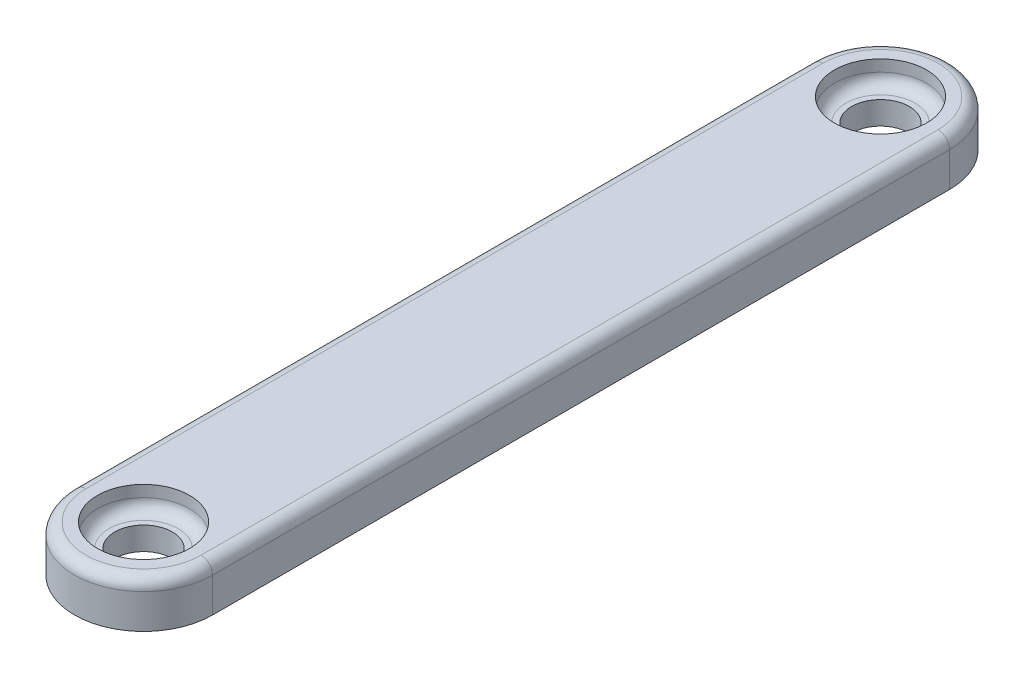
ISO-10303-21;
HEADER;
FILE_DESCRIPTION(('STEP AP214'),'2;1');
FILE_NAME('part.step','',(''),(''),'','','');
FILE_SCHEMA(('AUTOMOTIVE_DESIGN { 1 0 10303 214 1 1 1 1 }'));
ENDSEC;
DATA;
#1=APPLICATION_CONTEXT('core data for automotive mechanical design processes');
#2=APPLICATION_PROTOCOL_DEFINITION('international standard','automotive_design',2000,#1);
#3=PRODUCT_CONTEXT('',#1,'mechanical');
#4=PRODUCT('Part','Part','',(#3));
#5=PRODUCT_RELATED_PRODUCT_CATEGORY('part','',(#4));
#6=PRODUCT_DEFINITION_FORMATION('','',#4);
#7=PRODUCT_DEFINITION_CONTEXT('part definition',#1,'design');
#8=PRODUCT_DEFINITION('design','',#6,#7);
#9=PRODUCT_DEFINITION_SHAPE('','',#8);
#10=(LENGTH_UNIT() NAMED_UNIT(*) SI_UNIT(.MILLI.,.METRE.));
#11=(NAMED_UNIT(*) PLANE_ANGLE_UNIT() SI_UNIT($,.RADIAN.));
#12=(NAMED_UNIT(*) SI_UNIT($,.STERADIAN.) SOLID_ANGLE_UNIT());
#13=UNCERTAINTY_MEASURE_WITH_UNIT(LENGTH_MEASURE(1.E-05),#10,'distance_accuracy_value','');
#14=(GEOMETRIC_REPRESENTATION_CONTEXT(3) GLOBAL_UNCERTAINTY_ASSIGNED_CONTEXT((#13)) GLOBAL_UNIT_ASSIGNED_CONTEXT((#10,
#11,#12)) REPRESENTATION_CONTEXT('',''));
#15=CARTESIAN_POINT('',(0.,0.,0.));
#16=DIRECTION('',(0.,0.,1.));
#17=DIRECTION('',(1.,0.,0.));
#18=AXIS2_PLACEMENT_3D('',#15,#16,#17);
#19=CARTESIAN_POINT('',(0.,2.,16.));
#20=DIRECTION('',(0.,-1.,0.));
#21=DIRECTION('',(0.,0.,-1.));
#22=AXIS2_PLACEMENT_3D('',#19,#20,#21);
#23=CYLINDRICAL_SURFACE('',#22,1.25);
#24=CARTESIAN_POINT('',(0.,0.,16.));
#25=DIRECTION('',(0.,1.,0.));
#26=DIRECTION('',(0.,0.,1.));
#27=AXIS2_PLACEMENT_3D('',#24,#25,#26);
#28=CIRCLE('',#27,1.25);
#29=CARTESIAN_POINT('',(0.,0.,17.25));
#30=VERTEX_POINT('',#29);
#31=EDGE_CURVE('E114',#30,#30,#28,.T.);
#32=ORIENTED_EDGE('',*,*,#31,.F.);
#33=EDGE_LOOP('',(#32));
#34=FACE_BOUND('',#33,.T.);
#35=CARTESIAN_POINT('',(0.,1.,16.));
#36=DIRECTION('',(0.,1.,0.));
#37=DIRECTION('',(0.,0.,1.));
#38=AXIS2_PLACEMENT_3D('',#35,#36,#37);
#39=CIRCLE('',#38,1.25);
#40=CARTESIAN_POINT('',(0.,1.,17.25));
#41=VERTEX_POINT('',#40);
#42=EDGE_CURVE('E131',#41,#41,#39,.T.);
#43=ORIENTED_EDGE('',*,*,#42,.T.);
#44=EDGE_LOOP('',(#43));
#45=FACE_BOUND('',#44,.T.);
#46=ADVANCED_FACE('F34',(#34,#45),#23,.F.);
#47=CARTESIAN_POINT('',(0.,2.,16.));
#48=DIRECTION('',(0.,-1.,0.));
#49=DIRECTION('',(0.,0.,-1.));
#50=AXIS2_PLACEMENT_3D('',#47,#48,#49);
#51=PLANE('',#50);
#52=DIRECTION('',(0.,0.,1.));
#53=VECTOR('',#52,1.);
#54=CARTESIAN_POINT('',(-2.5,2.,16.));
#55=LINE('',#54,#53);
#56=CARTESIAN_POINT('',(-2.5,2.,-16.));
#57=VERTEX_POINT('',#56);
#58=CARTESIAN_POINT('',(-2.5,2.,16.));
#59=VERTEX_POINT('',#58);
#60=EDGE_CURVE('E138',#57,#59,#55,.T.);
#61=ORIENTED_EDGE('',*,*,#60,.T.);
#62=CARTESIAN_POINT('',(0.,2.,16.));
#63=DIRECTION('',(0.,-1.,0.));
#64=DIRECTION('',(0.,0.,-1.));
#65=AXIS2_PLACEMENT_3D('',#62,#63,#64);
#66=CIRCLE('',#65,2.5);
#67=CARTESIAN_POINT('',(2.5,2.,16.));
#68=VERTEX_POINT('',#67);
#69=EDGE_CURVE('E140',#59,#68,#66,.F.);
#70=ORIENTED_EDGE('',*,*,#69,.T.);
#71=DIRECTION('',(0.,0.,-1.));
#72=VECTOR('',#71,1.);
#73=CARTESIAN_POINT('',(2.5,2.,16.));
#74=LINE('',#73,#72);
#75=CARTESIAN_POINT('',(2.5,2.,-16.));
#76=VERTEX_POINT('',#75);
#77=EDGE_CURVE('E99',#68,#76,#74,.T.);
#78=ORIENTED_EDGE('',*,*,#77,.T.);
#79=CARTESIAN_POINT('',(0.,2.,-16.));
#80=DIRECTION('',(0.,-1.,0.));
#81=DIRECTION('',(0.,0.,-1.));
#82=AXIS2_PLACEMENT_3D('',#79,#80,#81);
#83=CIRCLE('',#82,2.5);
#84=EDGE_CURVE('E136',#76,#57,#83,.F.);
#85=ORIENTED_EDGE('',*,*,#84,.T.);
#86=EDGE_LOOP('',(#61,#70,#78,#85));
#87=FACE_BOUND('',#86,.T.);
#88=CARTESIAN_POINT('',(0.,2.,16.));
#89=DIRECTION('',(0.,1.,0.));
#90=DIRECTION('',(0.,0.,1.));
#91=AXIS2_PLACEMENT_3D('',#88,#89,#90);
#92=CIRCLE('',#91,2.);
#93=CARTESIAN_POINT('',(0.,2.,18.));
#94=VERTEX_POINT('',#93);
#95=EDGE_CURVE('E132',#94,#94,#92,.T.);
#96=ORIENTED_EDGE('',*,*,#95,.F.);
#97=EDGE_LOOP('',(#96));
#98=FACE_BOUND('',#97,.T.);
#99=CARTESIAN_POINT('',(0.,2.,-16.));
#100=DIRECTION('',(0.,1.,0.));
#101=DIRECTION('',(0.,0.,-1.));
#102=AXIS2_PLACEMENT_3D('',#99,#100,#101);
#103=CIRCLE('',#102,2.);
#104=CARTESIAN_POINT('',(0.,2.,-18.));
#105=VERTEX_POINT('',#104);
#106=EDGE_CURVE('E167',#105,#105,#103,.T.);
#107=ORIENTED_EDGE('',*,*,#106,.F.);
#108=EDGE_LOOP('',(#107));
#109=FACE_BOUND('',#108,.T.);
#110=ADVANCED_FACE('F198',(#87,#98,#109),#51,.F.);
#111=CARTESIAN_POINT('',(0.,0.,16.));
#112=DIRECTION('',(0.,-1.,0.));
#113=DIRECTION('',(0.,0.,-1.));
#114=AXIS2_PLACEMENT_3D('',#111,#112,#113);
#115=PLANE('',#114);
#116=ORIENTED_EDGE('',*,*,#31,.T.);
#117=EDGE_LOOP('',(#116));
#118=FACE_BOUND('',#117,.T.);
#119=CARTESIAN_POINT('',(0.,0.,16.));
#120=DIRECTION('',(0.,1.,0.));
#121=DIRECTION('',(0.,0.,-1.));
#122=AXIS2_PLACEMENT_3D('',#119,#120,#121);
#123=CIRCLE('',#122,3.);
#124=CARTESIAN_POINT('',(-3.,0.,16.));
#125=VERTEX_POINT('',#124);
#126=CARTESIAN_POINT('',(3.,0.,16.));
#127=VERTEX_POINT('',#126);
#128=EDGE_CURVE('E107',#125,#127,#123,.T.);
#129=ORIENTED_EDGE('',*,*,#128,.F.);
#130=DIRECTION('',(0.,0.,1.));
#131=VECTOR('',#130,1.);
#132=CARTESIAN_POINT('',(-3.,0.,16.));
#133=LINE('',#132,#131);
#134=CARTESIAN_POINT('',(-3.,0.,-16.));
#135=VERTEX_POINT('',#134);
#136=EDGE_CURVE('E122',#135,#125,#133,.T.);
#137=ORIENTED_EDGE('',*,*,#136,.F.);
#138=CARTESIAN_POINT('',(0.,0.,-16.));
#139=DIRECTION('',(0.,1.,0.));
#140=DIRECTION('',(0.,0.,-1.));
#141=AXIS2_PLACEMENT_3D('',#138,#139,#140);
#142=CIRCLE('',#141,3.);
#143=CARTESIAN_POINT('',(3.,0.,-16.));
#144=VERTEX_POINT('',#143);
#145=EDGE_CURVE('E109',#144,#135,#142,.T.);
#146=ORIENTED_EDGE('',*,*,#145,.F.);
#147=DIRECTION('',(0.,0.,-1.));
#148=VECTOR('',#147,1.);
#149=CARTESIAN_POINT('',(3.,0.,-16.));
#150=LINE('',#149,#148);
#151=EDGE_CURVE('E92',#127,#144,#150,.T.);
#152=ORIENTED_EDGE('',*,*,#151,.F.);
#153=EDGE_LOOP('',(#129,#137,#146,#152));
#154=FACE_BOUND('',#153,.T.);
#155=CARTESIAN_POINT('',(0.,0.,-16.));
#156=DIRECTION('',(0.,1.,0.));
#157=DIRECTION('',(0.,0.,1.));
#158=AXIS2_PLACEMENT_3D('',#155,#156,#157);
#159=CIRCLE('',#158,1.25);
#160=CARTESIAN_POINT('',(0.,0.,-14.75));
#161=VERTEX_POINT('',#160);
#162=EDGE_CURVE('E117',#161,#161,#159,.T.);
#163=ORIENTED_EDGE('',*,*,#162,.T.);
#164=EDGE_LOOP('',(#163));
#165=FACE_BOUND('',#164,.T.);
#166=ADVANCED_FACE('F104',(#118,#154,#165),#115,.T.);
#167=CARTESIAN_POINT('',(0.,2.,16.));
#168=DIRECTION('',(0.,-1.,0.));
#169=DIRECTION('',(0.,0.,-1.));
#170=AXIS2_PLACEMENT_3D('',#167,#168,#169);
#171=CYLINDRICAL_SURFACE('',#170,3.);
#172=DIRECTION('',(0.,-1.,0.));
#173=VECTOR('',#172,1.);
#174=CARTESIAN_POINT('',(3.,2.,16.));
#175=LINE('',#174,#173);
#176=CARTESIAN_POINT('',(3.,1.5,16.));
#177=VERTEX_POINT('',#176);
#178=EDGE_CURVE('E89',#177,#127,#175,.T.);
#179=ORIENTED_EDGE('',*,*,#178,.F.);
#180=CARTESIAN_POINT('',(0.,1.5,16.));
#181=DIRECTION('',(0.,-1.,0.));
#182=DIRECTION('',(0.,0.,-1.));
#183=AXIS2_PLACEMENT_3D('',#180,#181,#182);
#184=CIRCLE('',#183,3.);
#185=CARTESIAN_POINT('',(-3.,1.5,16.));
#186=VERTEX_POINT('',#185);
#187=EDGE_CURVE('E143',#177,#186,#184,.T.);
#188=ORIENTED_EDGE('',*,*,#187,.T.);
#189=DIRECTION('',(0.,-1.,0.));
#190=VECTOR('',#189,1.);
#191=CARTESIAN_POINT('',(-3.,2.,16.));
#192=LINE('',#191,#190);
#193=EDGE_CURVE('E112',#186,#125,#192,.T.);
#194=ORIENTED_EDGE('',*,*,#193,.T.);
#195=ORIENTED_EDGE('',*,*,#128,.T.);
#196=EDGE_LOOP('',(#179,#188,#194,#195));
#197=FACE_BOUND('',#196,.T.);
#198=ADVANCED_FACE('F111',(#197),#171,.T.);
#199=CARTESIAN_POINT('',(3.,2.,-16.));
#200=DIRECTION('',(-1.,0.,0.));
#201=DIRECTION('',(0.,0.,1.));
#202=AXIS2_PLACEMENT_3D('',#199,#200,#201);
#203=PLANE('',#202);
#204=DIRECTION('',(0.,-1.,0.));
#205=VECTOR('',#204,1.);
#206=CARTESIAN_POINT('',(3.,2.,-16.));
#207=LINE('',#206,#205);
#208=CARTESIAN_POINT('',(3.,1.5,-16.));
#209=VERTEX_POINT('',#208);
#210=EDGE_CURVE('E100',#209,#144,#207,.T.);
#211=ORIENTED_EDGE('',*,*,#210,.F.);
#212=DIRECTION('',(0.,0.,-1.));
#213=VECTOR('',#212,1.);
#214=CARTESIAN_POINT('',(3.,1.5,-16.));
#215=LINE('',#214,#213);
#216=EDGE_CURVE('E11',#209,#177,#215,.F.);
#217=ORIENTED_EDGE('',*,*,#216,.T.);
#218=ORIENTED_EDGE('',*,*,#178,.T.);
#219=ORIENTED_EDGE('',*,*,#151,.T.);
#220=EDGE_LOOP('',(#211,#217,#218,#219));
#221=FACE_BOUND('',#220,.T.);
#222=ADVANCED_FACE('F91',(#221),#203,.F.);
#223=CARTESIAN_POINT('',(0.,2.,-16.));
#224=DIRECTION('',(0.,-1.,0.));
#225=DIRECTION('',(0.,0.,-1.));
#226=AXIS2_PLACEMENT_3D('',#223,#224,#225);
#227=CYLINDRICAL_SURFACE('',#226,3.);
#228=DIRECTION('',(0.,-1.,0.));
#229=VECTOR('',#228,1.);
#230=CARTESIAN_POINT('',(-3.,2.,-16.));
#231=LINE('',#230,#229);
#232=CARTESIAN_POINT('',(-3.,1.5,-16.));
#233=VERTEX_POINT('',#232);
#234=EDGE_CURVE('E125',#233,#135,#231,.T.);
#235=ORIENTED_EDGE('',*,*,#234,.F.);
#236=CARTESIAN_POINT('',(0.,1.5,-16.));
#237=DIRECTION('',(0.,-1.,0.));
#238=DIRECTION('',(0.,0.,-1.));
#239=AXIS2_PLACEMENT_3D('',#236,#237,#238);
#240=CIRCLE('',#239,3.);
#241=EDGE_CURVE('E51',#233,#209,#240,.T.);
#242=ORIENTED_EDGE('',*,*,#241,.T.);
#243=ORIENTED_EDGE('',*,*,#210,.T.);
#244=ORIENTED_EDGE('',*,*,#145,.T.);
#245=EDGE_LOOP('',(#235,#242,#243,#244));
#246=FACE_BOUND('',#245,.T.);
#247=ADVANCED_FACE('F193',(#246),#227,.T.);
#248=CARTESIAN_POINT('',(-3.,2.,16.));
#249=DIRECTION('',(1.,0.,0.));
#250=DIRECTION('',(0.,0.,-1.));
#251=AXIS2_PLACEMENT_3D('',#248,#249,#250);
#252=PLANE('',#251);
#253=ORIENTED_EDGE('',*,*,#193,.F.);
#254=DIRECTION('',(0.,0.,1.));
#255=VECTOR('',#254,1.);
#256=CARTESIAN_POINT('',(-3.,1.5,16.));
#257=LINE('',#256,#255);
#258=EDGE_CURVE('E59',#186,#233,#257,.F.);
#259=ORIENTED_EDGE('',*,*,#258,.T.);
#260=ORIENTED_EDGE('',*,*,#234,.T.);
#261=ORIENTED_EDGE('',*,*,#136,.T.);
#262=EDGE_LOOP('',(#253,#259,#260,#261));
#263=FACE_BOUND('',#262,.T.);
#264=ADVANCED_FACE('F183',(#263),#252,.F.);
#265=CARTESIAN_POINT('',(0.,2.,-16.));
#266=DIRECTION('',(0.,-1.,0.));
#267=DIRECTION('',(0.,0.,-1.));
#268=AXIS2_PLACEMENT_3D('',#265,#266,#267);
#269=CYLINDRICAL_SURFACE('',#268,1.25);
#270=CARTESIAN_POINT('',(0.,1.,-16.));
#271=DIRECTION('',(0.,-1.,0.));
#272=DIRECTION('',(0.,0.,-1.));
#273=AXIS2_PLACEMENT_3D('',#270,#271,#272);
#274=CIRCLE('',#273,1.25);
#275=CARTESIAN_POINT('',(0.,1.,-17.25));
#276=VERTEX_POINT('',#275);
#277=EDGE_CURVE('E128',#276,#276,#274,.T.);
#278=ORIENTED_EDGE('',*,*,#277,.F.);
#279=EDGE_LOOP('',(#278));
#280=FACE_BOUND('',#279,.T.);
#281=ORIENTED_EDGE('',*,*,#162,.F.);
#282=EDGE_LOOP('',(#281));
#283=FACE_BOUND('',#282,.T.);
#284=ADVANCED_FACE('F180',(#280,#283),#269,.F.);
#285=CARTESIAN_POINT('',(0.,1.,-16.));
#286=DIRECTION('',(0.,1.,0.));
#287=DIRECTION('',(0.,0.,1.));
#288=AXIS2_PLACEMENT_3D('',#285,#286,#287);
#289=CYLINDRICAL_SURFACE('',#288,2.);
#290=CARTESIAN_POINT('',(0.,1.5,-16.));
#291=DIRECTION('',(0.,-1.,0.));
#292=DIRECTION('',(0.,0.,-1.));
#293=AXIS2_PLACEMENT_3D('',#290,#291,#292);
#294=CIRCLE('',#293,2.);
#295=CARTESIAN_POINT('',(0.,1.5,-18.));
#296=VERTEX_POINT('',#295);
#297=EDGE_CURVE('E150',#296,#296,#294,.T.);
#298=ORIENTED_EDGE('',*,*,#297,.T.);
#299=EDGE_LOOP('',(#298));
#300=FACE_BOUND('',#299,.T.);
#301=ORIENTED_EDGE('',*,*,#106,.T.);
#302=EDGE_LOOP('',(#301));
#303=FACE_BOUND('',#302,.T.);
#304=ADVANCED_FACE('F182',(#300,#303),#289,.F.);
#305=CARTESIAN_POINT('',(0.,1.,-16.));
#306=DIRECTION('',(0.,-1.,0.));
#307=DIRECTION('',(0.,0.,-1.));
#308=AXIS2_PLACEMENT_3D('',#305,#306,#307);
#309=PLANE('',#308);
#310=CARTESIAN_POINT('',(0.,1.,-16.));
#311=DIRECTION('',(0.,-1.,0.));
#312=DIRECTION('',(0.,0.,-1.));
#313=AXIS2_PLACEMENT_3D('',#310,#311,#312);
#314=CIRCLE('',#313,1.5);
#315=CARTESIAN_POINT('',(0.,1.,-17.5));
#316=VERTEX_POINT('',#315);
#317=EDGE_CURVE('E147',#316,#316,#314,.F.);
#318=ORIENTED_EDGE('',*,*,#317,.T.);
#319=EDGE_LOOP('',(#318));
#320=FACE_BOUND('',#319,.T.);
#321=ORIENTED_EDGE('',*,*,#277,.T.);
#322=EDGE_LOOP('',(#321));
#323=FACE_BOUND('',#322,.T.);
#324=ADVANCED_FACE('F190',(#320,#323),#309,.F.);
#325=CARTESIAN_POINT('',(0.,1.,16.));
#326=DIRECTION('',(0.,1.,0.));
#327=DIRECTION('',(0.,0.,1.));
#328=AXIS2_PLACEMENT_3D('',#325,#326,#327);
#329=CYLINDRICAL_SURFACE('',#328,2.);
#330=CARTESIAN_POINT('',(0.,1.5,16.));
#331=DIRECTION('',(0.,1.,0.));
#332=DIRECTION('',(0.,0.,1.));
#333=AXIS2_PLACEMENT_3D('',#330,#331,#332);
#334=CIRCLE('',#333,2.);
#335=CARTESIAN_POINT('',(0.,1.5,18.));
#336=VERTEX_POINT('',#335);
#337=EDGE_CURVE('E43',#336,#336,#334,.F.);
#338=ORIENTED_EDGE('',*,*,#337,.T.);
#339=EDGE_LOOP('',(#338));
#340=FACE_BOUND('',#339,.T.);
#341=ORIENTED_EDGE('',*,*,#95,.T.);
#342=EDGE_LOOP('',(#341));
#343=FACE_BOUND('',#342,.T.);
#344=ADVANCED_FACE('F244',(#340,#343),#329,.F.);
#345=CARTESIAN_POINT('',(0.,1.,16.));
#346=DIRECTION('',(0.,1.,0.));
#347=DIRECTION('',(0.,0.,1.));
#348=AXIS2_PLACEMENT_3D('',#345,#346,#347);
#349=PLANE('',#348);
#350=CARTESIAN_POINT('',(0.,1.,16.));
#351=DIRECTION('',(0.,1.,0.));
#352=DIRECTION('',(0.,0.,1.));
#353=AXIS2_PLACEMENT_3D('',#350,#351,#352);
#354=CIRCLE('',#353,1.5);
#355=CARTESIAN_POINT('',(0.,1.,17.5));
#356=VERTEX_POINT('',#355);
#357=EDGE_CURVE('E153',#356,#356,#354,.T.);
#358=ORIENTED_EDGE('',*,*,#357,.T.);
#359=EDGE_LOOP('',(#358));
#360=FACE_BOUND('',#359,.T.);
#361=ORIENTED_EDGE('',*,*,#42,.F.);
#362=EDGE_LOOP('',(#361));
#363=FACE_BOUND('',#362,.T.);
#364=ADVANCED_FACE('F230',(#360,#363),#349,.T.);
#365=CARTESIAN_POINT('',(0.,1.5,-16.));
#366=DIRECTION('',(0.,-1.,0.));
#367=DIRECTION('',(0.,0.,-1.));
#368=AXIS2_PLACEMENT_3D('',#365,#366,#367);
#369=TOROIDAL_SURFACE('',#368,2.5,0.5);
#370=CARTESIAN_POINT('',(2.5,1.5,-16.));
#371=DIRECTION('',(0.,0.,1.));
#372=DIRECTION('',(1.,0.,0.));
#373=AXIS2_PLACEMENT_3D('',#370,#371,#372);
#374=CIRCLE('',#373,0.5);
#375=EDGE_CURVE('E161',#209,#76,#374,.T.);
#376=ORIENTED_EDGE('',*,*,#375,.F.);
#377=ORIENTED_EDGE('',*,*,#241,.F.);
#378=CARTESIAN_POINT('',(-2.5,1.5,-16.));
#379=DIRECTION('',(0.,0.,1.));
#380=DIRECTION('',(1.,0.,0.));
#381=AXIS2_PLACEMENT_3D('',#378,#379,#380);
#382=CIRCLE('',#381,0.5);
#383=EDGE_CURVE('E38',#57,#233,#382,.T.);
#384=ORIENTED_EDGE('',*,*,#383,.F.);
#385=ORIENTED_EDGE('',*,*,#84,.F.);
#386=EDGE_LOOP('',(#376,#377,#384,#385));
#387=FACE_BOUND('',#386,.T.);
#388=ADVANCED_FACE('F228',(#387),#369,.T.);
#389=CARTESIAN_POINT('',(-2.5,1.5,16.));
#390=DIRECTION('',(0.,0.,1.));
#391=DIRECTION('',(1.,0.,0.));
#392=AXIS2_PLACEMENT_3D('',#389,#390,#391);
#393=CYLINDRICAL_SURFACE('',#392,0.5);
#394=ORIENTED_EDGE('',*,*,#383,.T.);
#395=ORIENTED_EDGE('',*,*,#258,.F.);
#396=CARTESIAN_POINT('',(-2.5,1.5,16.));
#397=DIRECTION('',(0.,0.,1.));
#398=DIRECTION('',(1.,0.,0.));
#399=AXIS2_PLACEMENT_3D('',#396,#397,#398);
#400=CIRCLE('',#399,0.5);
#401=EDGE_CURVE('E160',#59,#186,#400,.T.);
#402=ORIENTED_EDGE('',*,*,#401,.F.);
#403=ORIENTED_EDGE('',*,*,#60,.F.);
#404=EDGE_LOOP('',(#394,#395,#402,#403));
#405=FACE_BOUND('',#404,.T.);
#406=ADVANCED_FACE('F225',(#405),#393,.T.);
#407=CARTESIAN_POINT('',(2.5,1.5,16.));
#408=DIRECTION('',(0.,0.,-1.));
#409=DIRECTION('',(-1.,0.,0.));
#410=AXIS2_PLACEMENT_3D('',#407,#408,#409);
#411=CYLINDRICAL_SURFACE('',#410,0.5);
#412=ORIENTED_EDGE('',*,*,#375,.T.);
#413=ORIENTED_EDGE('',*,*,#77,.F.);
#414=CARTESIAN_POINT('',(2.5,1.5,16.));
#415=DIRECTION('',(0.,0.,1.));
#416=DIRECTION('',(1.,0.,0.));
#417=AXIS2_PLACEMENT_3D('',#414,#415,#416);
#418=CIRCLE('',#417,0.5);
#419=EDGE_CURVE('E158',#177,#68,#418,.T.);
#420=ORIENTED_EDGE('',*,*,#419,.F.);
#421=ORIENTED_EDGE('',*,*,#216,.F.);
#422=EDGE_LOOP('',(#412,#413,#420,#421));
#423=FACE_BOUND('',#422,.T.);
#424=ADVANCED_FACE('F221',(#423),#411,.T.);
#425=CARTESIAN_POINT('',(0.,1.5,16.));
#426=DIRECTION('',(0.,-1.,0.));
#427=DIRECTION('',(0.,0.,-1.));
#428=AXIS2_PLACEMENT_3D('',#425,#426,#427);
#429=TOROIDAL_SURFACE('',#428,2.5,0.5);
#430=ORIENTED_EDGE('',*,*,#401,.T.);
#431=ORIENTED_EDGE('',*,*,#187,.F.);
#432=ORIENTED_EDGE('',*,*,#419,.T.);
#433=ORIENTED_EDGE('',*,*,#69,.F.);
#434=EDGE_LOOP('',(#430,#431,#432,#433));
#435=FACE_BOUND('',#434,.T.);
#436=ADVANCED_FACE('F217',(#435),#429,.T.);
#437=CARTESIAN_POINT('',(0.,1.5,-16.));
#438=DIRECTION('',(0.,-1.,0.));
#439=DIRECTION('',(0.,0.,-1.));
#440=AXIS2_PLACEMENT_3D('',#437,#438,#439);
#441=TOROIDAL_SURFACE('',#440,1.5,0.5);
#442=ORIENTED_EDGE('',*,*,#297,.F.);
#443=EDGE_LOOP('',(#442));
#444=FACE_BOUND('',#443,.T.);
#445=ORIENTED_EDGE('',*,*,#317,.F.);
#446=EDGE_LOOP('',(#445));
#447=FACE_BOUND('',#446,.T.);
#448=ADVANCED_FACE('F220',(#444,#447),#441,.F.);
#449=CARTESIAN_POINT('',(0.,1.5,16.));
#450=DIRECTION('',(0.,1.,0.));
#451=DIRECTION('',(0.,0.,1.));
#452=AXIS2_PLACEMENT_3D('',#449,#450,#451);
#453=TOROIDAL_SURFACE('',#452,1.5,0.5);
#454=ORIENTED_EDGE('',*,*,#337,.F.);
#455=EDGE_LOOP('',(#454));
#456=FACE_BOUND('',#455,.T.);
#457=ORIENTED_EDGE('',*,*,#357,.F.);
#458=EDGE_LOOP('',(#457));
#459=FACE_BOUND('',#458,.T.);
#460=ADVANCED_FACE('F36',(#456,#459),#453,.F.);
#461=CLOSED_SHELL('',(#46,#110,#166,#198,#222,#247,#264,#284,#304,#324,#344,#364,#388,#406,#424,
#436,#448,#460));
#462=MANIFOLD_SOLID_BREP('B2',#461);
#463=ADVANCED_BREP_SHAPE_REPRESENTATION('',(#18,#462),#14);
#464=SHAPE_DEFINITION_REPRESENTATION(#9,#463);
ENDSEC;
END-ISO-10303-21;
